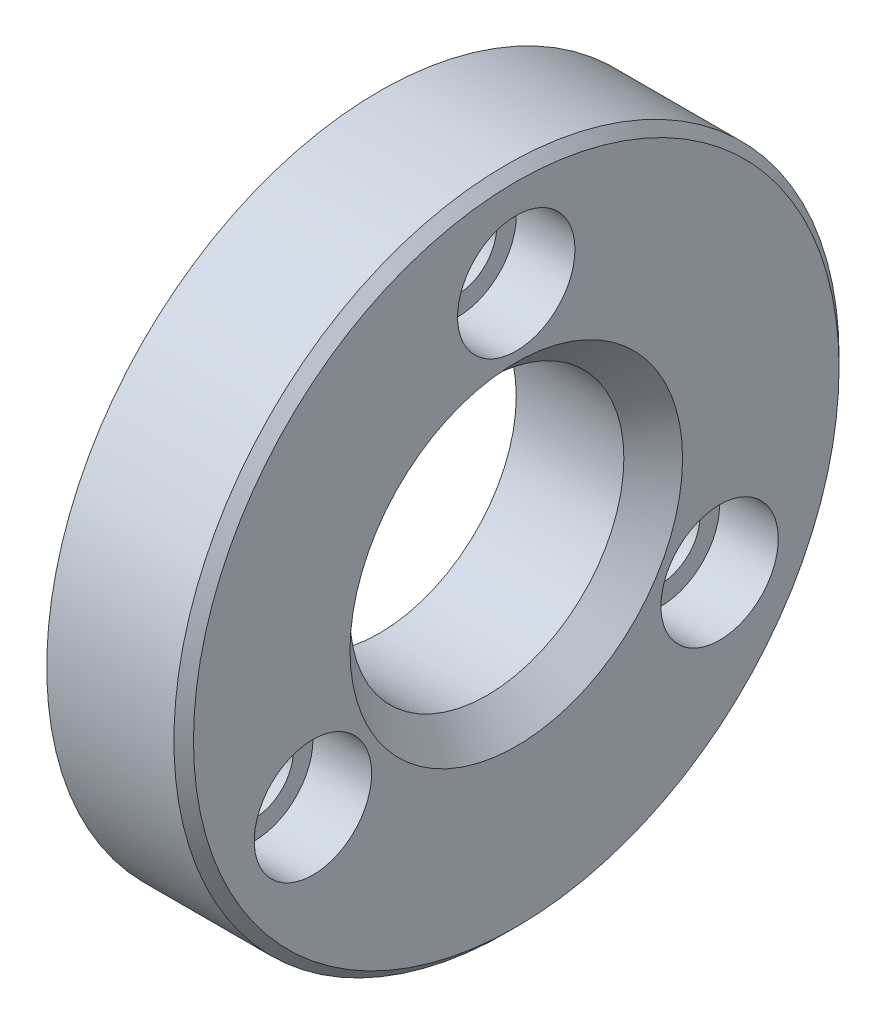
ISO-10303-21;
HEADER;
FILE_DESCRIPTION(('STEP AP214'),'2;1');
FILE_NAME('part.step','',(''),(''),'','','');
FILE_SCHEMA(('AUTOMOTIVE_DESIGN { 1 0 10303 214 1 1 1 1 }'));
ENDSEC;
DATA;
#1=APPLICATION_CONTEXT('core data for automotive mechanical design processes');
#2=APPLICATION_PROTOCOL_DEFINITION('international standard','automotive_design',2000,#1);
#3=PRODUCT_CONTEXT('',#1,'mechanical');
#4=PRODUCT('Part','Part','',(#3));
#5=PRODUCT_RELATED_PRODUCT_CATEGORY('part','',(#4));
#6=PRODUCT_DEFINITION_FORMATION('','',#4);
#7=PRODUCT_DEFINITION_CONTEXT('part definition',#1,'design');
#8=PRODUCT_DEFINITION('design','',#6,#7);
#9=PRODUCT_DEFINITION_SHAPE('','',#8);
#10=(LENGTH_UNIT() NAMED_UNIT(*) SI_UNIT(.MILLI.,.METRE.));
#11=(NAMED_UNIT(*) PLANE_ANGLE_UNIT() SI_UNIT($,.RADIAN.));
#12=(NAMED_UNIT(*) SI_UNIT($,.STERADIAN.) SOLID_ANGLE_UNIT());
#13=UNCERTAINTY_MEASURE_WITH_UNIT(LENGTH_MEASURE(1.E-05),#10,'distance_accuracy_value','');
#14=(GEOMETRIC_REPRESENTATION_CONTEXT(3) GLOBAL_UNCERTAINTY_ASSIGNED_CONTEXT((#13)) GLOBAL_UNIT_ASSIGNED_CONTEXT((#10,
#11,#12)) REPRESENTATION_CONTEXT('',''));
#15=CARTESIAN_POINT('',(0.,0.,0.));
#16=DIRECTION('',(0.,0.,1.));
#17=DIRECTION('',(1.,0.,0.));
#18=AXIS2_PLACEMENT_3D('',#15,#16,#17);
#19=CARTESIAN_POINT('',(7.,-6.00000000000045,10.3923048454125));
#20=DIRECTION('',(-1.,0.,0.));
#21=DIRECTION('',(0.,0.,1.));
#22=AXIS2_PLACEMENT_3D('',#19,#20,#21);
#23=CYLINDRICAL_SURFACE('',#22,2.00000000000097);
#24=CARTESIAN_POINT('',(0.,-6.00000000000045,10.3923048454125));
#25=DIRECTION('',(1.,0.,0.));
#26=DIRECTION('',(0.,0.,-1.));
#27=AXIS2_PLACEMENT_3D('',#24,#25,#26);
#28=CIRCLE('',#27,2.00000000000097);
#29=CARTESIAN_POINT('',(0.,-6.00000000000045,8.39230484541152));
#30=VERTEX_POINT('',#29);
#31=EDGE_CURVE('E84',#30,#30,#28,.T.);
#32=ORIENTED_EDGE('',*,*,#31,.F.);
#33=EDGE_LOOP('',(#32));
#34=FACE_BOUND('',#33,.T.);
#35=CARTESIAN_POINT('',(4.,-6.00000000000045,10.3923048454125));
#36=DIRECTION('',(1.,0.,0.));
#37=DIRECTION('',(0.,0.,-1.));
#38=AXIS2_PLACEMENT_3D('',#35,#36,#37);
#39=CIRCLE('',#38,2.00000000000097);
#40=CARTESIAN_POINT('',(4.,-6.00000000000045,8.39230484541152));
#41=VERTEX_POINT('',#40);
#42=EDGE_CURVE('E68',#41,#41,#39,.T.);
#43=ORIENTED_EDGE('',*,*,#42,.T.);
#44=EDGE_LOOP('',(#43));
#45=FACE_BOUND('',#44,.T.);
#46=ADVANCED_FACE('F41',(#34,#45),#23,.F.);
#47=CARTESIAN_POINT('',(7.,-5.99999999999956,-10.392304845414));
#48=DIRECTION('',(-1.,0.,0.));
#49=DIRECTION('',(0.,0.,1.));
#50=AXIS2_PLACEMENT_3D('',#47,#48,#49);
#51=CYLINDRICAL_SURFACE('',#50,2.00000000000066);
#52=CARTESIAN_POINT('',(0.,-5.99999999999956,-10.392304845414));
#53=DIRECTION('',(1.,0.,0.));
#54=DIRECTION('',(0.,0.,-1.));
#55=AXIS2_PLACEMENT_3D('',#52,#53,#54);
#56=CIRCLE('',#55,2.00000000000066);
#57=CARTESIAN_POINT('',(0.,-5.99999999999956,-12.3923048454147));
#58=VERTEX_POINT('',#57);
#59=EDGE_CURVE('E97',#58,#58,#56,.T.);
#60=ORIENTED_EDGE('',*,*,#59,.F.);
#61=EDGE_LOOP('',(#60));
#62=FACE_BOUND('',#61,.T.);
#63=CARTESIAN_POINT('',(4.,-5.99999999999956,-10.392304845414));
#64=DIRECTION('',(1.,0.,0.));
#65=DIRECTION('',(0.,0.,-1.));
#66=AXIS2_PLACEMENT_3D('',#63,#64,#65);
#67=CIRCLE('',#66,2.00000000000066);
#68=CARTESIAN_POINT('',(4.,-5.99999999999956,-12.3923048454147));
#69=VERTEX_POINT('',#68);
#70=EDGE_CURVE('E74',#69,#69,#67,.T.);
#71=ORIENTED_EDGE('',*,*,#70,.T.);
#72=EDGE_LOOP('',(#71));
#73=FACE_BOUND('',#72,.T.);
#74=ADVANCED_FACE('F163',(#62,#73),#51,.F.);
#75=CARTESIAN_POINT('',(7.,12.,0.));
#76=DIRECTION('',(-1.,0.,0.));
#77=DIRECTION('',(0.,0.,1.));
#78=AXIS2_PLACEMENT_3D('',#75,#76,#77);
#79=CYLINDRICAL_SURFACE('',#78,2.);
#80=CARTESIAN_POINT('',(0.,12.,0.));
#81=DIRECTION('',(1.,0.,0.));
#82=DIRECTION('',(0.,0.,-1.));
#83=AXIS2_PLACEMENT_3D('',#80,#81,#82);
#84=CIRCLE('',#83,2.);
#85=CARTESIAN_POINT('',(0.,12.,-2.));
#86=VERTEX_POINT('',#85);
#87=EDGE_CURVE('E93',#86,#86,#84,.T.);
#88=ORIENTED_EDGE('',*,*,#87,.F.);
#89=EDGE_LOOP('',(#88));
#90=FACE_BOUND('',#89,.T.);
#91=CARTESIAN_POINT('',(4.,12.,0.));
#92=DIRECTION('',(1.,0.,0.));
#93=DIRECTION('',(0.,0.,-1.));
#94=AXIS2_PLACEMENT_3D('',#91,#92,#93);
#95=CIRCLE('',#94,2.);
#96=CARTESIAN_POINT('',(4.,12.,-2.));
#97=VERTEX_POINT('',#96);
#98=EDGE_CURVE('E80',#97,#97,#95,.T.);
#99=ORIENTED_EDGE('',*,*,#98,.T.);
#100=EDGE_LOOP('',(#99));
#101=FACE_BOUND('',#100,.T.);
#102=ADVANCED_FACE('F138',(#90,#101),#79,.F.);
#103=CARTESIAN_POINT('',(7.,0.,0.));
#104=DIRECTION('',(1.,0.,0.));
#105=DIRECTION('',(0.,0.,-1.));
#106=AXIS2_PLACEMENT_3D('',#103,#104,#105);
#107=PLANE('',#106);
#108=CARTESIAN_POINT('',(7.,0.,0.));
#109=DIRECTION('',(1.,0.,0.));
#110=DIRECTION('',(0.,0.,-1.));
#111=AXIS2_PLACEMENT_3D('',#108,#109,#110);
#112=CIRCLE('',#111,16.5);
#113=CARTESIAN_POINT('',(7.,0.,-16.5));
#114=VERTEX_POINT('',#113);
#115=EDGE_CURVE('E49',#114,#114,#112,.T.);
#116=ORIENTED_EDGE('',*,*,#115,.T.);
#117=EDGE_LOOP('',(#116));
#118=FACE_BOUND('',#117,.T.);
#119=CARTESIAN_POINT('',(7.,0.,0.));
#120=DIRECTION('',(1.,0.,0.));
#121=DIRECTION('',(0.,0.,-1.));
#122=AXIS2_PLACEMENT_3D('',#119,#120,#121);
#123=CIRCLE('',#122,8.50000000000001);
#124=CARTESIAN_POINT('',(7.,0.,-8.50000000000001));
#125=VERTEX_POINT('',#124);
#126=EDGE_CURVE('E55',#125,#125,#123,.F.);
#127=ORIENTED_EDGE('',*,*,#126,.T.);
#128=EDGE_LOOP('',(#127));
#129=FACE_BOUND('',#128,.T.);
#130=CARTESIAN_POINT('',(7.,-6.00000000000045,10.3923048454125));
#131=DIRECTION('',(1.,0.,0.));
#132=DIRECTION('',(0.,0.,-1.));
#133=AXIS2_PLACEMENT_3D('',#130,#131,#132);
#134=CIRCLE('',#133,3.00000000000097);
#135=CARTESIAN_POINT('',(7.,-6.00000000000045,7.39230484541153));
#136=VERTEX_POINT('',#135);
#137=EDGE_CURVE('E116',#136,#136,#134,.T.);
#138=ORIENTED_EDGE('',*,*,#137,.F.);
#139=EDGE_LOOP('',(#138));
#140=FACE_BOUND('',#139,.T.);
#141=CARTESIAN_POINT('',(7.,-5.99999999999956,-10.392304845414));
#142=DIRECTION('',(1.,0.,0.));
#143=DIRECTION('',(0.,0.,-1.));
#144=AXIS2_PLACEMENT_3D('',#141,#142,#143);
#145=CIRCLE('',#144,3.00000000000066);
#146=CARTESIAN_POINT('',(7.,-5.99999999999956,-13.3923048454147));
#147=VERTEX_POINT('',#146);
#148=EDGE_CURVE('E72',#147,#147,#145,.T.);
#149=ORIENTED_EDGE('',*,*,#148,.F.);
#150=EDGE_LOOP('',(#149));
#151=FACE_BOUND('',#150,.T.);
#152=CARTESIAN_POINT('',(7.,12.,0.));
#153=DIRECTION('',(1.,0.,0.));
#154=DIRECTION('',(0.,0.,-1.));
#155=AXIS2_PLACEMENT_3D('',#152,#153,#154);
#156=CIRCLE('',#155,3.);
#157=CARTESIAN_POINT('',(7.,12.,-3.));
#158=VERTEX_POINT('',#157);
#159=EDGE_CURVE('E78',#158,#158,#156,.T.);
#160=ORIENTED_EDGE('',*,*,#159,.F.);
#161=EDGE_LOOP('',(#160));
#162=FACE_BOUND('',#161,.T.);
#163=ADVANCED_FACE('F134',(#118,#129,#140,#151,#162),#107,.T.);
#164=CARTESIAN_POINT('',(0.,0.,0.));
#165=DIRECTION('',(1.,0.,0.));
#166=DIRECTION('',(0.,0.,-1.));
#167=AXIS2_PLACEMENT_3D('',#164,#165,#166);
#168=PLANE('',#167);
#169=CARTESIAN_POINT('',(0.,0.,0.));
#170=DIRECTION('',(1.,0.,0.));
#171=DIRECTION('',(0.,0.,-1.));
#172=AXIS2_PLACEMENT_3D('',#169,#170,#171);
#173=CIRCLE('',#172,17.);
#174=CARTESIAN_POINT('',(0.,0.,-17.));
#175=VERTEX_POINT('',#174);
#176=EDGE_CURVE('E67',#175,#175,#173,.T.);
#177=ORIENTED_EDGE('',*,*,#176,.F.);
#178=EDGE_LOOP('',(#177));
#179=FACE_BOUND('',#178,.T.);
#180=CARTESIAN_POINT('',(0.,0.,0.));
#181=DIRECTION('',(1.,0.,0.));
#182=DIRECTION('',(0.,0.,-1.));
#183=AXIS2_PLACEMENT_3D('',#180,#181,#182);
#184=CIRCLE('',#183,7.);
#185=CARTESIAN_POINT('',(0.,0.,-7.));
#186=VERTEX_POINT('',#185);
#187=EDGE_CURVE('E89',#186,#186,#184,.T.);
#188=ORIENTED_EDGE('',*,*,#187,.T.);
#189=EDGE_LOOP('',(#188));
#190=FACE_BOUND('',#189,.T.);
#191=ORIENTED_EDGE('',*,*,#87,.T.);
#192=EDGE_LOOP('',(#191));
#193=FACE_BOUND('',#192,.T.);
#194=ORIENTED_EDGE('',*,*,#59,.T.);
#195=EDGE_LOOP('',(#194));
#196=FACE_BOUND('',#195,.T.);
#197=ORIENTED_EDGE('',*,*,#31,.T.);
#198=EDGE_LOOP('',(#197));
#199=FACE_BOUND('',#198,.T.);
#200=ADVANCED_FACE('F137',(#179,#190,#193,#196,#199),#168,.F.);
#201=CARTESIAN_POINT('',(7.,0.,0.));
#202=DIRECTION('',(-1.,0.,0.));
#203=DIRECTION('',(0.,0.,1.));
#204=AXIS2_PLACEMENT_3D('',#201,#202,#203);
#205=CYLINDRICAL_SURFACE('',#204,17.);
#206=CARTESIAN_POINT('',(6.49999999999999,0.,0.));
#207=DIRECTION('',(1.,0.,0.));
#208=DIRECTION('',(0.,0.,-1.));
#209=AXIS2_PLACEMENT_3D('',#206,#207,#208);
#210=CIRCLE('',#209,17.);
#211=CARTESIAN_POINT('',(6.49999999999999,0.,-17.));
#212=VERTEX_POINT('',#211);
#213=EDGE_CURVE('E10',#212,#212,#210,.F.);
#214=ORIENTED_EDGE('',*,*,#213,.T.);
#215=EDGE_LOOP('',(#214));
#216=FACE_BOUND('',#215,.T.);
#217=ORIENTED_EDGE('',*,*,#176,.T.);
#218=EDGE_LOOP('',(#217));
#219=FACE_BOUND('',#218,.T.);
#220=ADVANCED_FACE('F157',(#216,#219),#205,.T.);
#221=CARTESIAN_POINT('',(7.,0.,0.));
#222=DIRECTION('',(-1.,0.,0.));
#223=DIRECTION('',(0.,0.,1.));
#224=AXIS2_PLACEMENT_3D('',#221,#222,#223);
#225=CYLINDRICAL_SURFACE('',#224,7.);
#226=CARTESIAN_POINT('',(5.49999999999999,0.,0.));
#227=DIRECTION('',(1.,0.,0.));
#228=DIRECTION('',(0.,0.,-1.));
#229=AXIS2_PLACEMENT_3D('',#226,#227,#228);
#230=CIRCLE('',#229,7.);
#231=CARTESIAN_POINT('',(5.49999999999999,0.,-7.));
#232=VERTEX_POINT('',#231);
#233=EDGE_CURVE('E61',#232,#232,#230,.T.);
#234=ORIENTED_EDGE('',*,*,#233,.T.);
#235=EDGE_LOOP('',(#234));
#236=FACE_BOUND('',#235,.T.);
#237=ORIENTED_EDGE('',*,*,#187,.F.);
#238=EDGE_LOOP('',(#237));
#239=FACE_BOUND('',#238,.T.);
#240=ADVANCED_FACE('F147',(#236,#239),#225,.F.);
#241=CARTESIAN_POINT('',(4.,12.,0.));
#242=DIRECTION('',(1.,0.,0.));
#243=DIRECTION('',(0.,0.,-1.));
#244=AXIS2_PLACEMENT_3D('',#241,#242,#243);
#245=CYLINDRICAL_SURFACE('',#244,3.);
#246=CARTESIAN_POINT('',(4.,12.,0.));
#247=DIRECTION('',(1.,0.,0.));
#248=DIRECTION('',(0.,0.,-1.));
#249=AXIS2_PLACEMENT_3D('',#246,#247,#248);
#250=CIRCLE('',#249,3.);
#251=CARTESIAN_POINT('',(4.,12.,-3.));
#252=VERTEX_POINT('',#251);
#253=EDGE_CURVE('E85',#252,#252,#250,.T.);
#254=ORIENTED_EDGE('',*,*,#253,.F.);
#255=EDGE_LOOP('',(#254));
#256=FACE_BOUND('',#255,.T.);
#257=ORIENTED_EDGE('',*,*,#159,.T.);
#258=EDGE_LOOP('',(#257));
#259=FACE_BOUND('',#258,.T.);
#260=ADVANCED_FACE('F144',(#256,#259),#245,.F.);
#261=CARTESIAN_POINT('',(4.,12.,0.));
#262=DIRECTION('',(1.,0.,0.));
#263=DIRECTION('',(0.,0.,-1.));
#264=AXIS2_PLACEMENT_3D('',#261,#262,#263);
#265=PLANE('',#264);
#266=ORIENTED_EDGE('',*,*,#98,.F.);
#267=EDGE_LOOP('',(#266));
#268=FACE_BOUND('',#267,.T.);
#269=ORIENTED_EDGE('',*,*,#253,.T.);
#270=EDGE_LOOP('',(#269));
#271=FACE_BOUND('',#270,.T.);
#272=ADVANCED_FACE('F146',(#268,#271),#265,.T.);
#273=CARTESIAN_POINT('',(4.,-5.99999999999956,-10.392304845414));
#274=DIRECTION('',(1.,0.,0.));
#275=DIRECTION('',(0.,0.,-1.));
#276=AXIS2_PLACEMENT_3D('',#273,#274,#275);
#277=CYLINDRICAL_SURFACE('',#276,3.00000000000066);
#278=CARTESIAN_POINT('',(4.,-5.99999999999956,-10.392304845414));
#279=DIRECTION('',(1.,0.,0.));
#280=DIRECTION('',(0.,0.,-1.));
#281=AXIS2_PLACEMENT_3D('',#278,#279,#280);
#282=CIRCLE('',#281,3.00000000000066);
#283=CARTESIAN_POINT('',(4.,-5.99999999999956,-13.3923048454147));
#284=VERTEX_POINT('',#283);
#285=EDGE_CURVE('E79',#284,#284,#282,.T.);
#286=ORIENTED_EDGE('',*,*,#285,.F.);
#287=EDGE_LOOP('',(#286));
#288=FACE_BOUND('',#287,.T.);
#289=ORIENTED_EDGE('',*,*,#148,.T.);
#290=EDGE_LOOP('',(#289));
#291=FACE_BOUND('',#290,.T.);
#292=ADVANCED_FACE('F154',(#288,#291),#277,.F.);
#293=CARTESIAN_POINT('',(4.,-5.99999999999956,-10.392304845414));
#294=DIRECTION('',(1.,0.,0.));
#295=DIRECTION('',(0.,0.,-1.));
#296=AXIS2_PLACEMENT_3D('',#293,#294,#295);
#297=PLANE('',#296);
#298=ORIENTED_EDGE('',*,*,#70,.F.);
#299=EDGE_LOOP('',(#298));
#300=FACE_BOUND('',#299,.T.);
#301=ORIENTED_EDGE('',*,*,#285,.T.);
#302=EDGE_LOOP('',(#301));
#303=FACE_BOUND('',#302,.T.);
#304=ADVANCED_FACE('F130',(#300,#303),#297,.T.);
#305=CARTESIAN_POINT('',(4.,-6.00000000000045,10.3923048454125));
#306=DIRECTION('',(1.,0.,0.));
#307=DIRECTION('',(0.,0.,-1.));
#308=AXIS2_PLACEMENT_3D('',#305,#306,#307);
#309=CYLINDRICAL_SURFACE('',#308,3.00000000000097);
#310=CARTESIAN_POINT('',(4.,-6.00000000000045,10.3923048454125));
#311=DIRECTION('',(1.,0.,0.));
#312=DIRECTION('',(0.,0.,-1.));
#313=AXIS2_PLACEMENT_3D('',#310,#311,#312);
#314=CIRCLE('',#313,3.00000000000097);
#315=CARTESIAN_POINT('',(4.,-6.00000000000045,7.39230484541153));
#316=VERTEX_POINT('',#315);
#317=EDGE_CURVE('E73',#316,#316,#314,.T.);
#318=ORIENTED_EDGE('',*,*,#317,.F.);
#319=EDGE_LOOP('',(#318));
#320=FACE_BOUND('',#319,.T.);
#321=ORIENTED_EDGE('',*,*,#137,.T.);
#322=EDGE_LOOP('',(#321));
#323=FACE_BOUND('',#322,.T.);
#324=ADVANCED_FACE('F127',(#320,#323),#309,.F.);
#325=CARTESIAN_POINT('',(4.,-6.00000000000045,10.3923048454125));
#326=DIRECTION('',(1.,0.,0.));
#327=DIRECTION('',(0.,0.,-1.));
#328=AXIS2_PLACEMENT_3D('',#325,#326,#327);
#329=PLANE('',#328);
#330=ORIENTED_EDGE('',*,*,#42,.F.);
#331=EDGE_LOOP('',(#330));
#332=FACE_BOUND('',#331,.T.);
#333=ORIENTED_EDGE('',*,*,#317,.T.);
#334=EDGE_LOOP('',(#333));
#335=FACE_BOUND('',#334,.T.);
#336=ADVANCED_FACE('F125',(#332,#335),#329,.T.);
#337=CARTESIAN_POINT('',(5.49999999999999,0.,0.));
#338=DIRECTION('',(1.,0.,0.));
#339=DIRECTION('',(0.,0.,-1.));
#340=AXIS2_PLACEMENT_3D('',#337,#338,#339);
#341=CONICAL_SURFACE('',#340,7.,0.785398163397449);
#342=ORIENTED_EDGE('',*,*,#126,.F.);
#343=EDGE_LOOP('',(#342));
#344=FACE_BOUND('',#343,.T.);
#345=ORIENTED_EDGE('',*,*,#233,.F.);
#346=EDGE_LOOP('',(#345));
#347=FACE_BOUND('',#346,.T.);
#348=ADVANCED_FACE('F180',(#344,#347),#341,.F.);
#349=CARTESIAN_POINT('',(7.,0.,0.));
#350=DIRECTION('',(-1.,0.,0.));
#351=DIRECTION('',(0.,0.,1.));
#352=AXIS2_PLACEMENT_3D('',#349,#350,#351);
#353=CONICAL_SURFACE('',#352,16.5,0.785398163397448);
#354=ORIENTED_EDGE('',*,*,#213,.F.);
#355=EDGE_LOOP('',(#354));
#356=FACE_BOUND('',#355,.T.);
#357=ORIENTED_EDGE('',*,*,#115,.F.);
#358=EDGE_LOOP('',(#357));
#359=FACE_BOUND('',#358,.T.);
#360=ADVANCED_FACE('F43',(#356,#359),#353,.T.);
#361=CLOSED_SHELL('',(#46,#74,#102,#163,#200,#220,#240,#260,#272,#292,#304,#324,#336,#348,#360));
#362=MANIFOLD_SOLID_BREP('B2',#361);
#363=ADVANCED_BREP_SHAPE_REPRESENTATION('',(#18,#362),#14);
#364=SHAPE_DEFINITION_REPRESENTATION(#9,#363);
ENDSEC;
END-ISO-10303-21;
